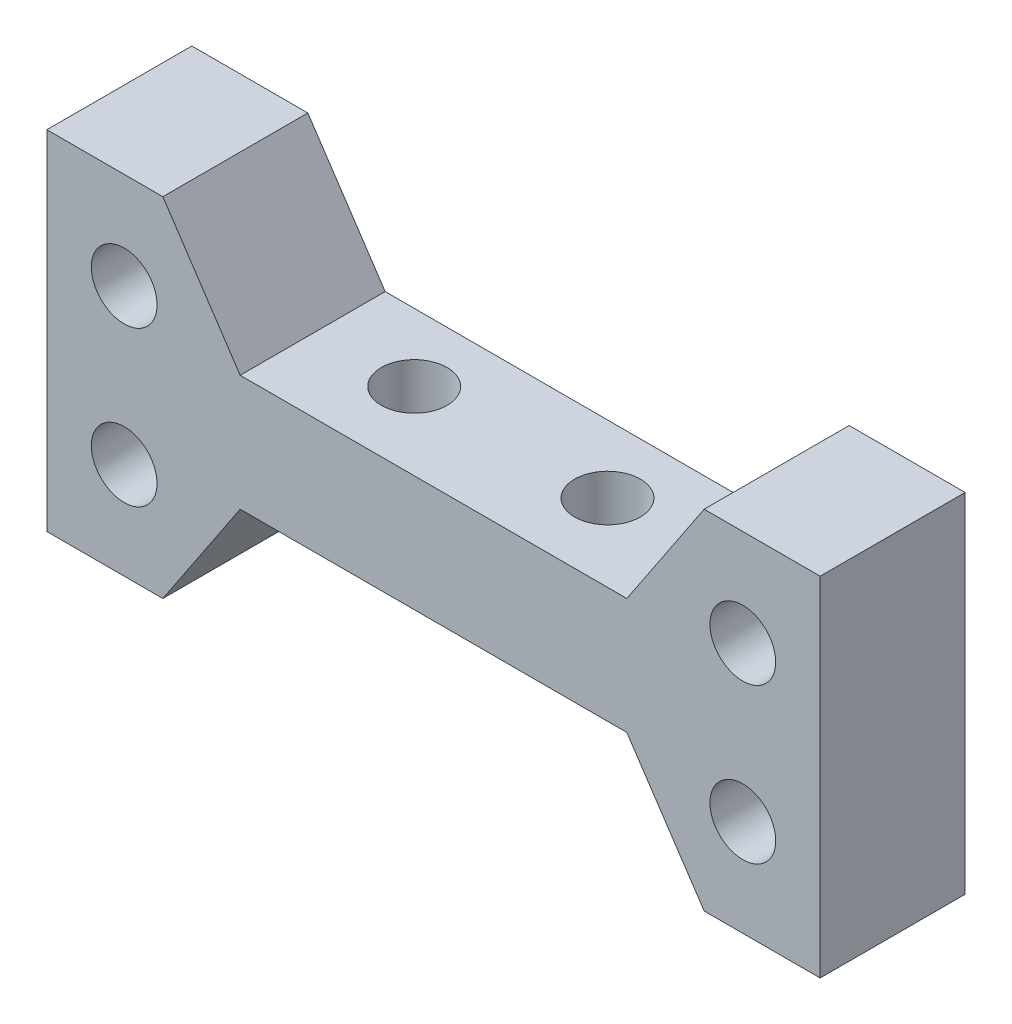
ISO-10303-21;
HEADER;
FILE_DESCRIPTION(('STEP AP214'),'2;1');
FILE_NAME('part.step','',(''),(''),'','','');
FILE_SCHEMA(('AUTOMOTIVE_DESIGN { 1 0 10303 214 1 1 1 1 }'));
ENDSEC;
DATA;
#1=APPLICATION_CONTEXT('core data for automotive mechanical design processes');
#2=APPLICATION_PROTOCOL_DEFINITION('international standard','automotive_design',2000,#1);
#3=PRODUCT_CONTEXT('',#1,'mechanical');
#4=PRODUCT('Part','Part','',(#3));
#5=PRODUCT_RELATED_PRODUCT_CATEGORY('part','',(#4));
#6=PRODUCT_DEFINITION_FORMATION('','',#4);
#7=PRODUCT_DEFINITION_CONTEXT('part definition',#1,'design');
#8=PRODUCT_DEFINITION('design','',#6,#7);
#9=PRODUCT_DEFINITION_SHAPE('','',#8);
#10=(LENGTH_UNIT() NAMED_UNIT(*) SI_UNIT(.MILLI.,.METRE.));
#11=(NAMED_UNIT(*) PLANE_ANGLE_UNIT() SI_UNIT($,.RADIAN.));
#12=(NAMED_UNIT(*) SI_UNIT($,.STERADIAN.) SOLID_ANGLE_UNIT());
#13=UNCERTAINTY_MEASURE_WITH_UNIT(LENGTH_MEASURE(1.E-05),#10,'distance_accuracy_value','');
#14=(GEOMETRIC_REPRESENTATION_CONTEXT(3) GLOBAL_UNCERTAINTY_ASSIGNED_CONTEXT((#13)) GLOBAL_UNIT_ASSIGNED_CONTEXT((#10,
#11,#12)) REPRESENTATION_CONTEXT('',''));
#15=CARTESIAN_POINT('',(0.,0.,0.));
#16=DIRECTION('',(0.,0.,1.));
#17=DIRECTION('',(1.,0.,0.));
#18=AXIS2_PLACEMENT_3D('',#15,#16,#17);
#19=CARTESIAN_POINT('',(-20.,9.00000000000001,7.5));
#20=DIRECTION('',(0.,-1.,0.));
#21=DIRECTION('',(0.,0.,-1.));
#22=AXIS2_PLACEMENT_3D('',#19,#20,#21);
#23=PLANE('',#22);
#24=DIRECTION('',(-1.,0.,0.));
#25=VECTOR('',#24,1.);
#26=CARTESIAN_POINT('',(-20.,9.00000000000001,7.5));
#27=LINE('',#26,#25);
#28=CARTESIAN_POINT('',(-14.,9.00000000000001,7.5));
#29=VERTEX_POINT('',#28);
#30=CARTESIAN_POINT('',(-20.,9.00000000000001,7.5));
#31=VERTEX_POINT('',#30);
#32=EDGE_CURVE('E144',#29,#31,#27,.T.);
#33=ORIENTED_EDGE('',*,*,#32,.F.);
#34=DIRECTION('',(0.,0.,-1.));
#35=VECTOR('',#34,1.);
#36=CARTESIAN_POINT('',(-14.,9.00000000000001,7.5));
#37=LINE('',#36,#35);
#38=CARTESIAN_POINT('',(-14.,9.00000000000001,0.));
#39=VERTEX_POINT('',#38);
#40=EDGE_CURVE('E200',#29,#39,#37,.T.);
#41=ORIENTED_EDGE('',*,*,#40,.T.);
#42=DIRECTION('',(-1.,0.,0.));
#43=VECTOR('',#42,1.);
#44=CARTESIAN_POINT('',(-20.,9.00000000000001,0.));
#45=LINE('',#44,#43);
#46=CARTESIAN_POINT('',(-20.,9.00000000000001,0.));
#47=VERTEX_POINT('',#46);
#48=EDGE_CURVE('E158',#39,#47,#45,.T.);
#49=ORIENTED_EDGE('',*,*,#48,.T.);
#50=DIRECTION('',(0.,0.,-1.));
#51=VECTOR('',#50,1.);
#52=CARTESIAN_POINT('',(-20.,9.00000000000001,7.5));
#53=LINE('',#52,#51);
#54=EDGE_CURVE('E41',#31,#47,#53,.T.);
#55=ORIENTED_EDGE('',*,*,#54,.F.);
#56=EDGE_LOOP('',(#33,#41,#49,#55));
#57=FACE_BOUND('',#56,.T.);
#58=ADVANCED_FACE('F33',(#57),#23,.F.);
#59=CARTESIAN_POINT('',(-20.,-8.99999999999999,7.5));
#60=DIRECTION('',(0.,1.,0.));
#61=DIRECTION('',(0.,0.,1.));
#62=AXIS2_PLACEMENT_3D('',#59,#60,#61);
#63=PLANE('',#62);
#64=DIRECTION('',(1.,0.,0.));
#65=VECTOR('',#64,1.);
#66=CARTESIAN_POINT('',(-20.,-8.99999999999999,0.));
#67=LINE('',#66,#65);
#68=CARTESIAN_POINT('',(-20.,-8.99999999999999,0.));
#69=VERTEX_POINT('',#68);
#70=CARTESIAN_POINT('',(-14.,-8.99999999999999,0.));
#71=VERTEX_POINT('',#70);
#72=EDGE_CURVE('E164',#69,#71,#67,.T.);
#73=ORIENTED_EDGE('',*,*,#72,.T.);
#74=DIRECTION('',(0.,0.,-1.));
#75=VECTOR('',#74,1.);
#76=CARTESIAN_POINT('',(-14.,-8.99999999999999,7.5));
#77=LINE('',#76,#75);
#78=CARTESIAN_POINT('',(-14.,-8.99999999999999,7.5));
#79=VERTEX_POINT('',#78);
#80=EDGE_CURVE('E193',#79,#71,#77,.T.);
#81=ORIENTED_EDGE('',*,*,#80,.F.);
#82=DIRECTION('',(1.,0.,0.));
#83=VECTOR('',#82,1.);
#84=CARTESIAN_POINT('',(-20.,-8.99999999999999,7.5));
#85=LINE('',#84,#83);
#86=CARTESIAN_POINT('',(-20.,-8.99999999999999,7.5));
#87=VERTEX_POINT('',#86);
#88=EDGE_CURVE('E151',#87,#79,#85,.T.);
#89=ORIENTED_EDGE('',*,*,#88,.F.);
#90=DIRECTION('',(0.,0.,-1.));
#91=VECTOR('',#90,1.);
#92=CARTESIAN_POINT('',(-20.,-8.99999999999999,7.5));
#93=LINE('',#92,#91);
#94=EDGE_CURVE('E169',#87,#69,#93,.T.);
#95=ORIENTED_EDGE('',*,*,#94,.T.);
#96=EDGE_LOOP('',(#73,#81,#89,#95));
#97=FACE_BOUND('',#96,.T.);
#98=ADVANCED_FACE('F191',(#97),#63,.F.);
#99=CARTESIAN_POINT('',(20.,-8.99999999999999,7.5));
#100=DIRECTION('',(-1.,0.,0.));
#101=DIRECTION('',(0.,0.,1.));
#102=AXIS2_PLACEMENT_3D('',#99,#100,#101);
#103=PLANE('',#102);
#104=DIRECTION('',(0.,1.,0.));
#105=VECTOR('',#104,1.);
#106=CARTESIAN_POINT('',(20.,-8.99999999999999,0.));
#107=LINE('',#106,#105);
#108=CARTESIAN_POINT('',(20.,-8.99999999999999,0.));
#109=VERTEX_POINT('',#108);
#110=CARTESIAN_POINT('',(20.,9.00000000000001,0.));
#111=VERTEX_POINT('',#110);
#112=EDGE_CURVE('E155',#109,#111,#107,.T.);
#113=ORIENTED_EDGE('',*,*,#112,.T.);
#114=DIRECTION('',(0.,0.,-1.));
#115=VECTOR('',#114,1.);
#116=CARTESIAN_POINT('',(20.,9.00000000000001,7.5));
#117=LINE('',#116,#115);
#118=CARTESIAN_POINT('',(20.,9.00000000000001,7.5));
#119=VERTEX_POINT('',#118);
#120=EDGE_CURVE('E11',#119,#111,#117,.T.);
#121=ORIENTED_EDGE('',*,*,#120,.F.);
#122=DIRECTION('',(0.,1.,0.));
#123=VECTOR('',#122,1.);
#124=CARTESIAN_POINT('',(20.,-8.99999999999999,7.5));
#125=LINE('',#124,#123);
#126=CARTESIAN_POINT('',(20.,-8.99999999999999,7.5));
#127=VERTEX_POINT('',#126);
#128=EDGE_CURVE('E141',#127,#119,#125,.T.);
#129=ORIENTED_EDGE('',*,*,#128,.F.);
#130=DIRECTION('',(0.,0.,-1.));
#131=VECTOR('',#130,1.);
#132=CARTESIAN_POINT('',(20.,-8.99999999999999,7.5));
#133=LINE('',#132,#131);
#134=EDGE_CURVE('E154',#127,#109,#133,.T.);
#135=ORIENTED_EDGE('',*,*,#134,.T.);
#136=EDGE_LOOP('',(#113,#121,#129,#135));
#137=FACE_BOUND('',#136,.T.);
#138=ADVANCED_FACE('F35',(#137),#103,.F.);
#139=CARTESIAN_POINT('',(14.,9.00000000000001,0.));
#140=VERTEX_POINT('',#139);
#141=EDGE_CURVE('E136',#111,#140,#45,.T.);
#142=ORIENTED_EDGE('',*,*,#141,.T.);
#143=DIRECTION('',(0.,0.,-1.));
#144=VECTOR('',#143,1.);
#145=CARTESIAN_POINT('',(14.,9.00000000000001,7.5));
#146=LINE('',#145,#144);
#147=CARTESIAN_POINT('',(14.,9.00000000000001,7.5));
#148=VERTEX_POINT('',#147);
#149=EDGE_CURVE('E56',#148,#140,#146,.T.);
#150=ORIENTED_EDGE('',*,*,#149,.F.);
#151=EDGE_CURVE('E134',#119,#148,#27,.T.);
#152=ORIENTED_EDGE('',*,*,#151,.F.);
#153=ORIENTED_EDGE('',*,*,#120,.T.);
#154=EDGE_LOOP('',(#142,#150,#152,#153));
#155=FACE_BOUND('',#154,.T.);
#156=ADVANCED_FACE('F133',(#155),#23,.F.);
#157=CARTESIAN_POINT('',(-20.,-8.99999999999999,7.5));
#158=DIRECTION('',(1.,0.,0.));
#159=DIRECTION('',(0.,0.,-1.));
#160=AXIS2_PLACEMENT_3D('',#157,#158,#159);
#161=PLANE('',#160);
#162=DIRECTION('',(0.,-1.,0.));
#163=VECTOR('',#162,1.);
#164=CARTESIAN_POINT('',(-20.,-8.99999999999999,0.));
#165=LINE('',#164,#163);
#166=EDGE_CURVE('E161',#47,#69,#165,.T.);
#167=ORIENTED_EDGE('',*,*,#166,.T.);
#168=ORIENTED_EDGE('',*,*,#94,.F.);
#169=DIRECTION('',(0.,-1.,0.));
#170=VECTOR('',#169,1.);
#171=CARTESIAN_POINT('',(-20.,-8.99999999999999,7.5));
#172=LINE('',#171,#170);
#173=EDGE_CURVE('E143',#31,#87,#172,.T.);
#174=ORIENTED_EDGE('',*,*,#173,.F.);
#175=ORIENTED_EDGE('',*,*,#54,.T.);
#176=EDGE_LOOP('',(#167,#168,#174,#175));
#177=FACE_BOUND('',#176,.T.);
#178=ADVANCED_FACE('F176',(#177),#161,.F.);
#179=CARTESIAN_POINT('',(14.,-8.99999999999999,7.5));
#180=VERTEX_POINT('',#179);
#181=EDGE_CURVE('E146',#180,#127,#85,.T.);
#182=ORIENTED_EDGE('',*,*,#181,.F.);
#183=DIRECTION('',(0.,0.,-1.));
#184=VECTOR('',#183,1.);
#185=CARTESIAN_POINT('',(14.,-8.99999999999999,7.5));
#186=LINE('',#185,#184);
#187=CARTESIAN_POINT('',(14.,-8.99999999999999,0.));
#188=VERTEX_POINT('',#187);
#189=EDGE_CURVE('E230',#180,#188,#186,.T.);
#190=ORIENTED_EDGE('',*,*,#189,.T.);
#191=EDGE_CURVE('E163',#188,#109,#67,.T.);
#192=ORIENTED_EDGE('',*,*,#191,.T.);
#193=ORIENTED_EDGE('',*,*,#134,.F.);
#194=EDGE_LOOP('',(#182,#190,#192,#193));
#195=FACE_BOUND('',#194,.T.);
#196=ADVANCED_FACE('F242',(#195),#63,.F.);
#197=CARTESIAN_POINT('',(0.,0.,7.5));
#198=DIRECTION('',(0.,0.,-1.));
#199=DIRECTION('',(-1.,0.,0.));
#200=AXIS2_PLACEMENT_3D('',#197,#198,#199);
#201=PLANE('',#200);
#202=CARTESIAN_POINT('',(-16.,4.,7.5));
#203=DIRECTION('',(0.,0.,-1.));
#204=DIRECTION('',(-1.,0.,0.));
#205=AXIS2_PLACEMENT_3D('',#202,#203,#204);
#206=CIRCLE('',#205,1.7);
#207=CARTESIAN_POINT('',(-17.7,4.,7.5));
#208=VERTEX_POINT('',#207);
#209=EDGE_CURVE('E334',#208,#208,#206,.T.);
#210=ORIENTED_EDGE('',*,*,#209,.T.);
#211=EDGE_LOOP('',(#210));
#212=FACE_BOUND('',#211,.T.);
#213=CARTESIAN_POINT('',(16.,-4.,7.5));
#214=DIRECTION('',(0.,0.,-1.));
#215=DIRECTION('',(-1.,0.,0.));
#216=AXIS2_PLACEMENT_3D('',#213,#214,#215);
#217=CIRCLE('',#216,1.7);
#218=CARTESIAN_POINT('',(14.3,-4.,7.5));
#219=VERTEX_POINT('',#218);
#220=EDGE_CURVE('E218',#219,#219,#217,.T.);
#221=ORIENTED_EDGE('',*,*,#220,.T.);
#222=EDGE_LOOP('',(#221));
#223=FACE_BOUND('',#222,.T.);
#224=CARTESIAN_POINT('',(16.,4.,7.5));
#225=DIRECTION('',(0.,0.,-1.));
#226=DIRECTION('',(-1.,0.,0.));
#227=AXIS2_PLACEMENT_3D('',#224,#225,#226);
#228=CIRCLE('',#227,1.7);
#229=CARTESIAN_POINT('',(14.3,4.,7.5));
#230=VERTEX_POINT('',#229);
#231=EDGE_CURVE('E211',#230,#230,#228,.T.);
#232=ORIENTED_EDGE('',*,*,#231,.T.);
#233=EDGE_LOOP('',(#232));
#234=FACE_BOUND('',#233,.T.);
#235=CARTESIAN_POINT('',(-16.,-4.,7.5));
#236=DIRECTION('',(0.,0.,-1.));
#237=DIRECTION('',(-1.,0.,0.));
#238=AXIS2_PLACEMENT_3D('',#235,#236,#237);
#239=CIRCLE('',#238,1.7);
#240=CARTESIAN_POINT('',(-17.7,-4.,7.5));
#241=VERTEX_POINT('',#240);
#242=EDGE_CURVE('E320',#241,#241,#239,.T.);
#243=ORIENTED_EDGE('',*,*,#242,.T.);
#244=EDGE_LOOP('',(#243));
#245=FACE_BOUND('',#244,.T.);
#246=DIRECTION('',(-1.,0.,0.));
#247=VECTOR('',#246,1.);
#248=CARTESIAN_POINT('',(9.99999999999999,3.,7.5));
#249=LINE('',#248,#247);
#250=CARTESIAN_POINT('',(9.99999999999999,3.,7.5));
#251=VERTEX_POINT('',#250);
#252=CARTESIAN_POINT('',(-10.,3.,7.5));
#253=VERTEX_POINT('',#252);
#254=EDGE_CURVE('E128',#251,#253,#249,.T.);
#255=ORIENTED_EDGE('',*,*,#254,.T.);
#256=DIRECTION('',(-0.55470019622523,0.832050294337843,0.));
#257=VECTOR('',#256,1.);
#258=CARTESIAN_POINT('',(-10.,3.,7.5));
#259=LINE('',#258,#257);
#260=EDGE_CURVE('E137',#253,#29,#259,.T.);
#261=ORIENTED_EDGE('',*,*,#260,.T.);
#262=ORIENTED_EDGE('',*,*,#32,.T.);
#263=ORIENTED_EDGE('',*,*,#173,.T.);
#264=ORIENTED_EDGE('',*,*,#88,.T.);
#265=DIRECTION('',(0.554700196225229,0.832050294337844,0.));
#266=VECTOR('',#265,1.);
#267=CARTESIAN_POINT('',(-10.,-3.,7.5));
#268=LINE('',#267,#266);
#269=CARTESIAN_POINT('',(-10.,-3.,7.5));
#270=VERTEX_POINT('',#269);
#271=EDGE_CURVE('E196',#79,#270,#268,.T.);
#272=ORIENTED_EDGE('',*,*,#271,.T.);
#273=DIRECTION('',(1.,0.,0.));
#274=VECTOR('',#273,1.);
#275=CARTESIAN_POINT('',(9.99999999999999,-3.,7.5));
#276=LINE('',#275,#274);
#277=CARTESIAN_POINT('',(9.99999999999999,-3.,7.5));
#278=VERTEX_POINT('',#277);
#279=EDGE_CURVE('E219',#270,#278,#276,.T.);
#280=ORIENTED_EDGE('',*,*,#279,.T.);
#281=DIRECTION('',(0.554700196225229,-0.832050294337843,0.));
#282=VECTOR('',#281,1.);
#283=CARTESIAN_POINT('',(14.,-8.99999999999999,7.5));
#284=LINE('',#283,#282);
#285=EDGE_CURVE('E221',#278,#180,#284,.T.);
#286=ORIENTED_EDGE('',*,*,#285,.T.);
#287=ORIENTED_EDGE('',*,*,#181,.T.);
#288=ORIENTED_EDGE('',*,*,#128,.T.);
#289=ORIENTED_EDGE('',*,*,#151,.T.);
#290=DIRECTION('',(-0.554700196225229,-0.832050294337843,0.));
#291=VECTOR('',#290,1.);
#292=CARTESIAN_POINT('',(14.,9.00000000000001,7.5));
#293=LINE('',#292,#291);
#294=EDGE_CURVE('E121',#148,#251,#293,.T.);
#295=ORIENTED_EDGE('',*,*,#294,.T.);
#296=EDGE_LOOP('',(#255,#261,#262,#263,#264,#272,#280,#286,#287,#288,#289,#295));
#297=FACE_BOUND('',#296,.T.);
#298=ADVANCED_FACE('F139',(#212,#223,#234,#245,#297),#201,.F.);
#299=CARTESIAN_POINT('',(0.,0.,0.));
#300=DIRECTION('',(0.,0.,-1.));
#301=DIRECTION('',(-1.,0.,0.));
#302=AXIS2_PLACEMENT_3D('',#299,#300,#301);
#303=PLANE('',#302);
#304=CARTESIAN_POINT('',(-16.,4.,0.));
#305=DIRECTION('',(0.,0.,-1.));
#306=DIRECTION('',(-1.,0.,0.));
#307=AXIS2_PLACEMENT_3D('',#304,#305,#306);
#308=CIRCLE('',#307,1.7);
#309=CARTESIAN_POINT('',(-17.7,4.,0.));
#310=VERTEX_POINT('',#309);
#311=EDGE_CURVE('E327',#310,#310,#308,.T.);
#312=ORIENTED_EDGE('',*,*,#311,.F.);
#313=EDGE_LOOP('',(#312));
#314=FACE_BOUND('',#313,.T.);
#315=CARTESIAN_POINT('',(16.,-4.,0.));
#316=DIRECTION('',(0.,0.,-1.));
#317=DIRECTION('',(-1.,0.,0.));
#318=AXIS2_PLACEMENT_3D('',#315,#316,#317);
#319=CIRCLE('',#318,1.7);
#320=CARTESIAN_POINT('',(14.3,-4.,0.));
#321=VERTEX_POINT('',#320);
#322=EDGE_CURVE('E331',#321,#321,#319,.T.);
#323=ORIENTED_EDGE('',*,*,#322,.F.);
#324=EDGE_LOOP('',(#323));
#325=FACE_BOUND('',#324,.T.);
#326=CARTESIAN_POINT('',(16.,4.,0.));
#327=DIRECTION('',(0.,0.,-1.));
#328=DIRECTION('',(-1.,0.,0.));
#329=AXIS2_PLACEMENT_3D('',#326,#327,#328);
#330=CIRCLE('',#329,1.7);
#331=CARTESIAN_POINT('',(14.3,4.,0.));
#332=VERTEX_POINT('',#331);
#333=EDGE_CURVE('E215',#332,#332,#330,.T.);
#334=ORIENTED_EDGE('',*,*,#333,.F.);
#335=EDGE_LOOP('',(#334));
#336=FACE_BOUND('',#335,.T.);
#337=DIRECTION('',(-0.55470019622523,0.832050294337843,0.));
#338=VECTOR('',#337,1.);
#339=CARTESIAN_POINT('',(-10.,3.,0.));
#340=LINE('',#339,#338);
#341=CARTESIAN_POINT('',(-10.,3.,0.));
#342=VERTEX_POINT('',#341);
#343=EDGE_CURVE('E129',#342,#39,#340,.T.);
#344=ORIENTED_EDGE('',*,*,#343,.F.);
#345=DIRECTION('',(-1.,0.,0.));
#346=VECTOR('',#345,1.);
#347=CARTESIAN_POINT('',(9.99999999999999,3.,0.));
#348=LINE('',#347,#346);
#349=CARTESIAN_POINT('',(9.99999999999999,3.,0.));
#350=VERTEX_POINT('',#349);
#351=EDGE_CURVE('E341',#350,#342,#348,.T.);
#352=ORIENTED_EDGE('',*,*,#351,.F.);
#353=DIRECTION('',(-0.554700196225229,-0.832050294337843,0.));
#354=VECTOR('',#353,1.);
#355=CARTESIAN_POINT('',(14.,9.00000000000001,0.));
#356=LINE('',#355,#354);
#357=EDGE_CURVE('E214',#140,#350,#356,.T.);
#358=ORIENTED_EDGE('',*,*,#357,.F.);
#359=ORIENTED_EDGE('',*,*,#141,.F.);
#360=ORIENTED_EDGE('',*,*,#112,.F.);
#361=ORIENTED_EDGE('',*,*,#191,.F.);
#362=DIRECTION('',(0.554700196225229,-0.832050294337843,0.));
#363=VECTOR('',#362,1.);
#364=CARTESIAN_POINT('',(14.,-8.99999999999999,0.));
#365=LINE('',#364,#363);
#366=CARTESIAN_POINT('',(9.99999999999999,-3.,0.));
#367=VERTEX_POINT('',#366);
#368=EDGE_CURVE('E204',#367,#188,#365,.T.);
#369=ORIENTED_EDGE('',*,*,#368,.F.);
#370=DIRECTION('',(1.,0.,0.));
#371=VECTOR('',#370,1.);
#372=CARTESIAN_POINT('',(9.99999999999999,-3.,0.));
#373=LINE('',#372,#371);
#374=CARTESIAN_POINT('',(-10.,-3.,0.));
#375=VERTEX_POINT('',#374);
#376=EDGE_CURVE('E48',#375,#367,#373,.T.);
#377=ORIENTED_EDGE('',*,*,#376,.F.);
#378=DIRECTION('',(0.554700196225229,0.832050294337844,0.));
#379=VECTOR('',#378,1.);
#380=CARTESIAN_POINT('',(-10.,-3.,0.));
#381=LINE('',#380,#379);
#382=EDGE_CURVE('E188',#71,#375,#381,.T.);
#383=ORIENTED_EDGE('',*,*,#382,.F.);
#384=ORIENTED_EDGE('',*,*,#72,.F.);
#385=ORIENTED_EDGE('',*,*,#166,.F.);
#386=ORIENTED_EDGE('',*,*,#48,.F.);
#387=EDGE_LOOP('',(#344,#352,#358,#359,#360,#361,#369,#377,#383,#384,#385,#386));
#388=FACE_BOUND('',#387,.T.);
#389=CARTESIAN_POINT('',(-16.,-4.,0.));
#390=DIRECTION('',(0.,0.,-1.));
#391=DIRECTION('',(-1.,0.,0.));
#392=AXIS2_PLACEMENT_3D('',#389,#390,#391);
#393=CIRCLE('',#392,1.7);
#394=CARTESIAN_POINT('',(-17.7,-4.,0.));
#395=VERTEX_POINT('',#394);
#396=EDGE_CURVE('E316',#395,#395,#393,.T.);
#397=ORIENTED_EDGE('',*,*,#396,.F.);
#398=EDGE_LOOP('',(#397));
#399=FACE_BOUND('',#398,.T.);
#400=ADVANCED_FACE('F184',(#314,#325,#336,#388,#399),#303,.T.);
#401=CARTESIAN_POINT('',(9.99999999999999,-3.,7.5));
#402=DIRECTION('',(0.,1.,0.));
#403=DIRECTION('',(0.,0.,1.));
#404=AXIS2_PLACEMENT_3D('',#401,#402,#403);
#405=PLANE('',#404);
#406=CARTESIAN_POINT('',(-4.99999999999997,-3.,3.49999999999999));
#407=DIRECTION('',(0.,1.,0.));
#408=DIRECTION('',(0.,0.,1.));
#409=AXIS2_PLACEMENT_3D('',#406,#407,#408);
#410=CIRCLE('',#409,1.7);
#411=CARTESIAN_POINT('',(-4.99999999999997,-3.,5.19999999999999));
#412=VERTEX_POINT('',#411);
#413=EDGE_CURVE('E315',#412,#412,#410,.T.);
#414=ORIENTED_EDGE('',*,*,#413,.T.);
#415=EDGE_LOOP('',(#414));
#416=FACE_BOUND('',#415,.T.);
#417=CARTESIAN_POINT('',(5.00000000000003,-3.,3.49999999999998));
#418=DIRECTION('',(0.,1.,0.));
#419=DIRECTION('',(0.,0.,1.));
#420=AXIS2_PLACEMENT_3D('',#417,#418,#419);
#421=CIRCLE('',#420,1.7);
#422=CARTESIAN_POINT('',(5.00000000000003,-3.,5.19999999999999));
#423=VERTEX_POINT('',#422);
#424=EDGE_CURVE('E317',#423,#423,#421,.T.);
#425=ORIENTED_EDGE('',*,*,#424,.T.);
#426=EDGE_LOOP('',(#425));
#427=FACE_BOUND('',#426,.T.);
#428=ORIENTED_EDGE('',*,*,#376,.T.);
#429=DIRECTION('',(0.,0.,-1.));
#430=VECTOR('',#429,1.);
#431=CARTESIAN_POINT('',(9.99999999999999,-3.,7.5));
#432=LINE('',#431,#430);
#433=EDGE_CURVE('E224',#278,#367,#432,.T.);
#434=ORIENTED_EDGE('',*,*,#433,.F.);
#435=ORIENTED_EDGE('',*,*,#279,.F.);
#436=DIRECTION('',(0.,0.,-1.));
#437=VECTOR('',#436,1.);
#438=CARTESIAN_POINT('',(-10.,-3.,7.5));
#439=LINE('',#438,#437);
#440=EDGE_CURVE('E159',#270,#375,#439,.T.);
#441=ORIENTED_EDGE('',*,*,#440,.T.);
#442=EDGE_LOOP('',(#428,#434,#435,#441));
#443=FACE_BOUND('',#442,.T.);
#444=ADVANCED_FACE('F261',(#416,#427,#443),#405,.F.);
#445=CARTESIAN_POINT('',(-10.,-3.,7.5));
#446=DIRECTION('',(-0.832050294337844,0.554700196225229,0.));
#447=DIRECTION('',(-0.554700196225229,-0.832050294337844,0.));
#448=AXIS2_PLACEMENT_3D('',#445,#446,#447);
#449=PLANE('',#448);
#450=ORIENTED_EDGE('',*,*,#382,.T.);
#451=ORIENTED_EDGE('',*,*,#440,.F.);
#452=ORIENTED_EDGE('',*,*,#271,.F.);
#453=ORIENTED_EDGE('',*,*,#80,.T.);
#454=EDGE_LOOP('',(#450,#451,#452,#453));
#455=FACE_BOUND('',#454,.T.);
#456=ADVANCED_FACE('F268',(#455),#449,.F.);
#457=CARTESIAN_POINT('',(14.,-8.99999999999999,7.5));
#458=DIRECTION('',(0.832050294337843,0.554700196225229,0.));
#459=DIRECTION('',(-0.554700196225229,0.832050294337843,0.));
#460=AXIS2_PLACEMENT_3D('',#457,#458,#459);
#461=PLANE('',#460);
#462=ORIENTED_EDGE('',*,*,#368,.T.);
#463=ORIENTED_EDGE('',*,*,#189,.F.);
#464=ORIENTED_EDGE('',*,*,#285,.F.);
#465=ORIENTED_EDGE('',*,*,#433,.T.);
#466=EDGE_LOOP('',(#462,#463,#464,#465));
#467=FACE_BOUND('',#466,.T.);
#468=ADVANCED_FACE('F235',(#467),#461,.F.);
#469=CARTESIAN_POINT('',(-16.,-4.,7.5));
#470=DIRECTION('',(0.,0.,-1.));
#471=DIRECTION('',(-1.,0.,0.));
#472=AXIS2_PLACEMENT_3D('',#469,#470,#471);
#473=CYLINDRICAL_SURFACE('',#472,1.7);
#474=ORIENTED_EDGE('',*,*,#242,.F.);
#475=EDGE_LOOP('',(#474));
#476=FACE_BOUND('',#475,.T.);
#477=ORIENTED_EDGE('',*,*,#396,.T.);
#478=EDGE_LOOP('',(#477));
#479=FACE_BOUND('',#478,.T.);
#480=ADVANCED_FACE('F272',(#476,#479),#473,.F.);
#481=CARTESIAN_POINT('',(-10.,3.,7.5));
#482=DIRECTION('',(-0.832050294337843,-0.55470019622523,0.));
#483=DIRECTION('',(0.55470019622523,-0.832050294337843,0.));
#484=AXIS2_PLACEMENT_3D('',#481,#482,#483);
#485=PLANE('',#484);
#486=ORIENTED_EDGE('',*,*,#343,.T.);
#487=ORIENTED_EDGE('',*,*,#40,.F.);
#488=ORIENTED_EDGE('',*,*,#260,.F.);
#489=DIRECTION('',(0.,0.,-1.));
#490=VECTOR('',#489,1.);
#491=CARTESIAN_POINT('',(-10.,3.,7.5));
#492=LINE('',#491,#490);
#493=EDGE_CURVE('E202',#253,#342,#492,.T.);
#494=ORIENTED_EDGE('',*,*,#493,.T.);
#495=EDGE_LOOP('',(#486,#487,#488,#494));
#496=FACE_BOUND('',#495,.T.);
#497=ADVANCED_FACE('F286',(#496),#485,.F.);
#498=CARTESIAN_POINT('',(9.99999999999999,3.,7.5));
#499=DIRECTION('',(0.,-1.,0.));
#500=DIRECTION('',(0.,0.,-1.));
#501=AXIS2_PLACEMENT_3D('',#498,#499,#500);
#502=PLANE('',#501);
#503=CARTESIAN_POINT('',(-4.99999999999997,3.,3.49999999999999));
#504=DIRECTION('',(0.,1.,0.));
#505=DIRECTION('',(0.,0.,1.));
#506=AXIS2_PLACEMENT_3D('',#503,#504,#505);
#507=CIRCLE('',#506,1.7);
#508=CARTESIAN_POINT('',(-4.99999999999997,3.,5.19999999999999));
#509=VERTEX_POINT('',#508);
#510=EDGE_CURVE('E312',#509,#509,#507,.T.);
#511=ORIENTED_EDGE('',*,*,#510,.F.);
#512=EDGE_LOOP('',(#511));
#513=FACE_BOUND('',#512,.T.);
#514=CARTESIAN_POINT('',(5.00000000000003,3.,3.49999999999998));
#515=DIRECTION('',(0.,1.,0.));
#516=DIRECTION('',(0.,0.,1.));
#517=AXIS2_PLACEMENT_3D('',#514,#515,#516);
#518=CIRCLE('',#517,1.7);
#519=CARTESIAN_POINT('',(5.00000000000003,3.,5.19999999999999));
#520=VERTEX_POINT('',#519);
#521=EDGE_CURVE('E362',#520,#520,#518,.T.);
#522=ORIENTED_EDGE('',*,*,#521,.F.);
#523=EDGE_LOOP('',(#522));
#524=FACE_BOUND('',#523,.T.);
#525=ORIENTED_EDGE('',*,*,#351,.T.);
#526=ORIENTED_EDGE('',*,*,#493,.F.);
#527=ORIENTED_EDGE('',*,*,#254,.F.);
#528=DIRECTION('',(0.,0.,-1.));
#529=VECTOR('',#528,1.);
#530=CARTESIAN_POINT('',(9.99999999999999,3.,7.5));
#531=LINE('',#530,#529);
#532=EDGE_CURVE('E123',#251,#350,#531,.T.);
#533=ORIENTED_EDGE('',*,*,#532,.T.);
#534=EDGE_LOOP('',(#525,#526,#527,#533));
#535=FACE_BOUND('',#534,.T.);
#536=ADVANCED_FACE('F283',(#513,#524,#535),#502,.F.);
#537=CARTESIAN_POINT('',(14.,9.00000000000001,7.5));
#538=DIRECTION('',(0.832050294337843,-0.554700196225229,0.));
#539=DIRECTION('',(0.554700196225229,0.832050294337844,0.));
#540=AXIS2_PLACEMENT_3D('',#537,#538,#539);
#541=PLANE('',#540);
#542=ORIENTED_EDGE('',*,*,#357,.T.);
#543=ORIENTED_EDGE('',*,*,#532,.F.);
#544=ORIENTED_EDGE('',*,*,#294,.F.);
#545=ORIENTED_EDGE('',*,*,#149,.T.);
#546=EDGE_LOOP('',(#542,#543,#544,#545));
#547=FACE_BOUND('',#546,.T.);
#548=ADVANCED_FACE('F122',(#547),#541,.F.);
#549=CARTESIAN_POINT('',(16.,4.,7.5));
#550=DIRECTION('',(0.,0.,-1.));
#551=DIRECTION('',(-1.,0.,0.));
#552=AXIS2_PLACEMENT_3D('',#549,#550,#551);
#553=CYLINDRICAL_SURFACE('',#552,1.7);
#554=ORIENTED_EDGE('',*,*,#231,.F.);
#555=EDGE_LOOP('',(#554));
#556=FACE_BOUND('',#555,.T.);
#557=ORIENTED_EDGE('',*,*,#333,.T.);
#558=EDGE_LOOP('',(#557));
#559=FACE_BOUND('',#558,.T.);
#560=ADVANCED_FACE('F276',(#556,#559),#553,.F.);
#561=CARTESIAN_POINT('',(16.,-4.,7.5));
#562=DIRECTION('',(0.,0.,-1.));
#563=DIRECTION('',(-1.,0.,0.));
#564=AXIS2_PLACEMENT_3D('',#561,#562,#563);
#565=CYLINDRICAL_SURFACE('',#564,1.7);
#566=ORIENTED_EDGE('',*,*,#220,.F.);
#567=EDGE_LOOP('',(#566));
#568=FACE_BOUND('',#567,.T.);
#569=ORIENTED_EDGE('',*,*,#322,.T.);
#570=EDGE_LOOP('',(#569));
#571=FACE_BOUND('',#570,.T.);
#572=ADVANCED_FACE('F279',(#568,#571),#565,.F.);
#573=CARTESIAN_POINT('',(-16.,4.,7.5));
#574=DIRECTION('',(0.,0.,-1.));
#575=DIRECTION('',(-1.,0.,0.));
#576=AXIS2_PLACEMENT_3D('',#573,#574,#575);
#577=CYLINDRICAL_SURFACE('',#576,1.7);
#578=ORIENTED_EDGE('',*,*,#209,.F.);
#579=EDGE_LOOP('',(#578));
#580=FACE_BOUND('',#579,.T.);
#581=ORIENTED_EDGE('',*,*,#311,.T.);
#582=EDGE_LOOP('',(#581));
#583=FACE_BOUND('',#582,.T.);
#584=ADVANCED_FACE('F290',(#580,#583),#577,.F.);
#585=CARTESIAN_POINT('',(5.00000000000003,-8.99999999999999,3.49999999999998));
#586=DIRECTION('',(0.,1.,0.));
#587=DIRECTION('',(0.,0.,1.));
#588=AXIS2_PLACEMENT_3D('',#585,#586,#587);
#589=CYLINDRICAL_SURFACE('',#588,1.7);
#590=ORIENTED_EDGE('',*,*,#521,.T.);
#591=EDGE_LOOP('',(#590));
#592=FACE_BOUND('',#591,.T.);
#593=ORIENTED_EDGE('',*,*,#424,.F.);
#594=EDGE_LOOP('',(#593));
#595=FACE_BOUND('',#594,.T.);
#596=ADVANCED_FACE('F293',(#592,#595),#589,.F.);
#597=CARTESIAN_POINT('',(-4.99999999999997,-8.99999999999999,3.49999999999999));
#598=DIRECTION('',(0.,1.,0.));
#599=DIRECTION('',(0.,0.,1.));
#600=AXIS2_PLACEMENT_3D('',#597,#598,#599);
#601=CYLINDRICAL_SURFACE('',#600,1.7);
#602=ORIENTED_EDGE('',*,*,#510,.T.);
#603=EDGE_LOOP('',(#602));
#604=FACE_BOUND('',#603,.T.);
#605=ORIENTED_EDGE('',*,*,#413,.F.);
#606=EDGE_LOOP('',(#605));
#607=FACE_BOUND('',#606,.T.);
#608=ADVANCED_FACE('F303',(#604,#607),#601,.F.);
#609=CLOSED_SHELL('',(#58,#98,#138,#156,#178,#196,#298,#400,#444,#456,#468,#480,#497,#536,#548,
#560,#572,#584,#596,#608));
#610=MANIFOLD_SOLID_BREP('B2',#609);
#611=ADVANCED_BREP_SHAPE_REPRESENTATION('',(#18,#610),#14);
#612=SHAPE_DEFINITION_REPRESENTATION(#9,#611);
ENDSEC;
END-ISO-10303-21;
